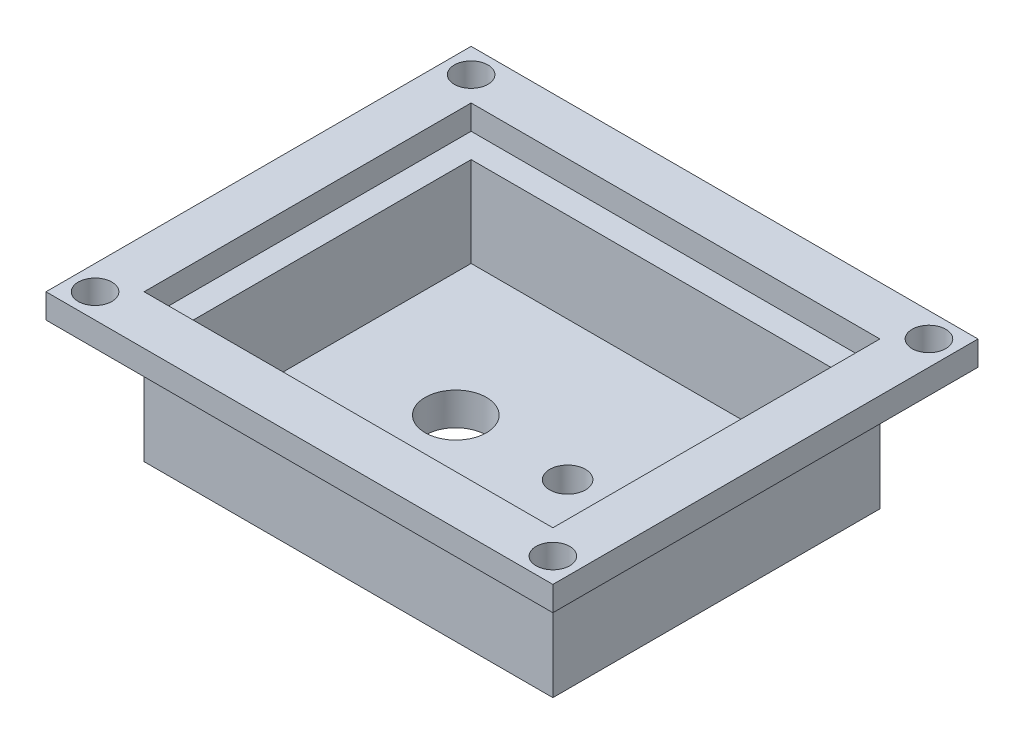
ISO-10303-21;
HEADER;
FILE_DESCRIPTION(('STEP AP214'),'2;1');
FILE_NAME('part.step','',(''),(''),'','','');
FILE_SCHEMA(('AUTOMOTIVE_DESIGN { 1 0 10303 214 1 1 1 1 }'));
ENDSEC;
DATA;
#1=APPLICATION_CONTEXT('core data for automotive mechanical design processes');
#2=APPLICATION_PROTOCOL_DEFINITION('international standard','automotive_design',2000,#1);
#3=PRODUCT_CONTEXT('',#1,'mechanical');
#4=PRODUCT('Part','Part','',(#3));
#5=PRODUCT_RELATED_PRODUCT_CATEGORY('part','',(#4));
#6=PRODUCT_DEFINITION_FORMATION('','',#4);
#7=PRODUCT_DEFINITION_CONTEXT('part definition',#1,'design');
#8=PRODUCT_DEFINITION('design','',#6,#7);
#9=PRODUCT_DEFINITION_SHAPE('','',#8);
#10=(LENGTH_UNIT() NAMED_UNIT(*) SI_UNIT(.MILLI.,.METRE.));
#11=(NAMED_UNIT(*) PLANE_ANGLE_UNIT() SI_UNIT($,.RADIAN.));
#12=(NAMED_UNIT(*) SI_UNIT($,.STERADIAN.) SOLID_ANGLE_UNIT());
#13=UNCERTAINTY_MEASURE_WITH_UNIT(LENGTH_MEASURE(1.E-05),#10,'distance_accuracy_value','');
#14=(GEOMETRIC_REPRESENTATION_CONTEXT(3) GLOBAL_UNCERTAINTY_ASSIGNED_CONTEXT((#13)) GLOBAL_UNIT_ASSIGNED_CONTEXT((#10,
#11,#12)) REPRESENTATION_CONTEXT('',''));
#15=CARTESIAN_POINT('',(0.,0.,0.));
#16=DIRECTION('',(0.,0.,1.));
#17=DIRECTION('',(1.,0.,0.));
#18=AXIS2_PLACEMENT_3D('',#15,#16,#17);
#19=CARTESIAN_POINT('',(-39.37,22.86,0.));
#20=DIRECTION('',(1.,0.,0.));
#21=DIRECTION('',(0.,0.,-1.));
#22=AXIS2_PLACEMENT_3D('',#19,#20,#21);
#23=PLANE('',#22);
#24=DIRECTION('',(0.,0.,1.));
#25=VECTOR('',#24,1.);
#26=CARTESIAN_POINT('',(-39.37,19.05,0.));
#27=LINE('',#26,#25);
#28=CARTESIAN_POINT('',(-39.37,19.05,-33.02));
#29=VERTEX_POINT('',#28);
#30=CARTESIAN_POINT('',(-39.37,19.05,33.02));
#31=VERTEX_POINT('',#30);
#32=EDGE_CURVE('E162',#29,#31,#27,.T.);
#33=ORIENTED_EDGE('',*,*,#32,.T.);
#34=DIRECTION('',(0.,-1.,0.));
#35=VECTOR('',#34,1.);
#36=CARTESIAN_POINT('',(-39.37,22.86,33.02));
#37=LINE('',#36,#35);
#38=CARTESIAN_POINT('',(-39.37,22.86,33.02));
#39=VERTEX_POINT('',#38);
#40=EDGE_CURVE('E12',#39,#31,#37,.T.);
#41=ORIENTED_EDGE('',*,*,#40,.F.);
#42=DIRECTION('',(0.,0.,1.));
#43=VECTOR('',#42,1.);
#44=CARTESIAN_POINT('',(-39.37,22.86,0.));
#45=LINE('',#44,#43);
#46=CARTESIAN_POINT('',(-39.37,22.86,-33.02));
#47=VERTEX_POINT('',#46);
#48=EDGE_CURVE('E134',#47,#39,#45,.T.);
#49=ORIENTED_EDGE('',*,*,#48,.F.);
#50=DIRECTION('',(0.,-1.,0.));
#51=VECTOR('',#50,1.);
#52=CARTESIAN_POINT('',(-39.37,22.86,-33.02));
#53=LINE('',#52,#51);
#54=EDGE_CURVE('E169',#47,#29,#53,.T.);
#55=ORIENTED_EDGE('',*,*,#54,.T.);
#56=EDGE_LOOP('',(#33,#41,#49,#55));
#57=FACE_BOUND('',#56,.T.);
#58=ADVANCED_FACE('F52',(#57),#23,.F.);
#59=CARTESIAN_POINT('',(0.,22.86,33.02));
#60=DIRECTION('',(0.,0.,-1.));
#61=DIRECTION('',(-1.,0.,0.));
#62=AXIS2_PLACEMENT_3D('',#59,#60,#61);
#63=PLANE('',#62);
#64=DIRECTION('',(1.,0.,0.));
#65=VECTOR('',#64,1.);
#66=CARTESIAN_POINT('',(0.,19.05,33.02));
#67=LINE('',#66,#65);
#68=CARTESIAN_POINT('',(39.37,19.05,33.02));
#69=VERTEX_POINT('',#68);
#70=EDGE_CURVE('E139',#31,#69,#67,.T.);
#71=ORIENTED_EDGE('',*,*,#70,.T.);
#72=DIRECTION('',(0.,-1.,0.));
#73=VECTOR('',#72,1.);
#74=CARTESIAN_POINT('',(39.37,22.86,33.02));
#75=LINE('',#74,#73);
#76=CARTESIAN_POINT('',(39.37,22.86,33.02));
#77=VERTEX_POINT('',#76);
#78=EDGE_CURVE('E64',#77,#69,#75,.T.);
#79=ORIENTED_EDGE('',*,*,#78,.F.);
#80=DIRECTION('',(1.,0.,0.));
#81=VECTOR('',#80,1.);
#82=CARTESIAN_POINT('',(0.,22.86,33.02));
#83=LINE('',#82,#81);
#84=EDGE_CURVE('E126',#39,#77,#83,.T.);
#85=ORIENTED_EDGE('',*,*,#84,.F.);
#86=ORIENTED_EDGE('',*,*,#40,.T.);
#87=EDGE_LOOP('',(#71,#79,#85,#86));
#88=FACE_BOUND('',#87,.T.);
#89=ADVANCED_FACE('F137',(#88),#63,.F.);
#90=CARTESIAN_POINT('',(39.37,22.86,0.));
#91=DIRECTION('',(-1.,0.,0.));
#92=DIRECTION('',(0.,0.,1.));
#93=AXIS2_PLACEMENT_3D('',#90,#91,#92);
#94=PLANE('',#93);
#95=DIRECTION('',(0.,0.,-1.));
#96=VECTOR('',#95,1.);
#97=CARTESIAN_POINT('',(39.37,19.05,0.));
#98=LINE('',#97,#96);
#99=CARTESIAN_POINT('',(39.37,19.05,-33.02));
#100=VERTEX_POINT('',#99);
#101=EDGE_CURVE('E103',#69,#100,#98,.T.);
#102=ORIENTED_EDGE('',*,*,#101,.T.);
#103=DIRECTION('',(0.,-1.,0.));
#104=VECTOR('',#103,1.);
#105=CARTESIAN_POINT('',(39.37,22.86,-33.02));
#106=LINE('',#105,#104);
#107=CARTESIAN_POINT('',(39.37,22.86,-33.02));
#108=VERTEX_POINT('',#107);
#109=EDGE_CURVE('E142',#108,#100,#106,.T.);
#110=ORIENTED_EDGE('',*,*,#109,.F.);
#111=DIRECTION('',(0.,0.,-1.));
#112=VECTOR('',#111,1.);
#113=CARTESIAN_POINT('',(39.37,22.86,0.));
#114=LINE('',#113,#112);
#115=EDGE_CURVE('E133',#77,#108,#114,.T.);
#116=ORIENTED_EDGE('',*,*,#115,.F.);
#117=ORIENTED_EDGE('',*,*,#78,.T.);
#118=EDGE_LOOP('',(#102,#110,#116,#117));
#119=FACE_BOUND('',#118,.T.);
#120=ADVANCED_FACE('F141',(#119),#94,.F.);
#121=CARTESIAN_POINT('',(31.75,22.86,0.));
#122=DIRECTION('',(-1.,0.,0.));
#123=DIRECTION('',(0.,0.,1.));
#124=AXIS2_PLACEMENT_3D('',#121,#122,#123);
#125=PLANE('',#124);
#126=DIRECTION('',(0.,0.,-1.));
#127=VECTOR('',#126,1.);
#128=CARTESIAN_POINT('',(31.75,19.05,0.));
#129=LINE('',#128,#127);
#130=CARTESIAN_POINT('',(31.75,19.05,25.4));
#131=VERTEX_POINT('',#130);
#132=CARTESIAN_POINT('',(31.75,19.05,-25.4));
#133=VERTEX_POINT('',#132);
#134=EDGE_CURVE('E146',#131,#133,#129,.T.);
#135=ORIENTED_EDGE('',*,*,#134,.F.);
#136=DIRECTION('',(0.,-1.,0.));
#137=VECTOR('',#136,1.);
#138=CARTESIAN_POINT('',(31.75,22.86,25.4));
#139=LINE('',#138,#137);
#140=CARTESIAN_POINT('',(31.75,22.86,25.4));
#141=VERTEX_POINT('',#140);
#142=EDGE_CURVE('E114',#141,#131,#139,.T.);
#143=ORIENTED_EDGE('',*,*,#142,.F.);
#144=DIRECTION('',(0.,0.,-1.));
#145=VECTOR('',#144,1.);
#146=CARTESIAN_POINT('',(31.75,22.86,0.));
#147=LINE('',#146,#145);
#148=CARTESIAN_POINT('',(31.75,22.86,-25.4));
#149=VERTEX_POINT('',#148);
#150=EDGE_CURVE('E166',#141,#149,#147,.T.);
#151=ORIENTED_EDGE('',*,*,#150,.T.);
#152=DIRECTION('',(0.,-1.,0.));
#153=VECTOR('',#152,1.);
#154=CARTESIAN_POINT('',(31.75,22.86,-25.4));
#155=LINE('',#154,#153);
#156=EDGE_CURVE('E143',#149,#133,#155,.T.);
#157=ORIENTED_EDGE('',*,*,#156,.T.);
#158=EDGE_LOOP('',(#135,#143,#151,#157));
#159=FACE_BOUND('',#158,.T.);
#160=ADVANCED_FACE('F54',(#159),#125,.T.);
#161=CARTESIAN_POINT('',(0.,22.86,25.4));
#162=DIRECTION('',(0.,0.,-1.));
#163=DIRECTION('',(-1.,0.,0.));
#164=AXIS2_PLACEMENT_3D('',#161,#162,#163);
#165=PLANE('',#164);
#166=DIRECTION('',(1.,0.,0.));
#167=VECTOR('',#166,1.);
#168=CARTESIAN_POINT('',(0.,19.05,25.4));
#169=LINE('',#168,#167);
#170=CARTESIAN_POINT('',(-31.75,19.05,25.4));
#171=VERTEX_POINT('',#170);
#172=EDGE_CURVE('E155',#171,#131,#169,.T.);
#173=ORIENTED_EDGE('',*,*,#172,.F.);
#174=DIRECTION('',(0.,-1.,0.));
#175=VECTOR('',#174,1.);
#176=CARTESIAN_POINT('',(-31.75,22.86,25.4));
#177=LINE('',#176,#175);
#178=CARTESIAN_POINT('',(-31.75,22.86,25.4));
#179=VERTEX_POINT('',#178);
#180=EDGE_CURVE('E174',#179,#171,#177,.T.);
#181=ORIENTED_EDGE('',*,*,#180,.F.);
#182=DIRECTION('',(1.,0.,0.));
#183=VECTOR('',#182,1.);
#184=CARTESIAN_POINT('',(0.,22.86,25.4));
#185=LINE('',#184,#183);
#186=EDGE_CURVE('E205',#179,#141,#185,.T.);
#187=ORIENTED_EDGE('',*,*,#186,.T.);
#188=ORIENTED_EDGE('',*,*,#142,.T.);
#189=EDGE_LOOP('',(#173,#181,#187,#188));
#190=FACE_BOUND('',#189,.T.);
#191=ADVANCED_FACE('F224',(#190),#165,.T.);
#192=CARTESIAN_POINT('',(-31.75,22.86,0.));
#193=DIRECTION('',(1.,0.,0.));
#194=DIRECTION('',(0.,0.,-1.));
#195=AXIS2_PLACEMENT_3D('',#192,#193,#194);
#196=PLANE('',#195);
#197=DIRECTION('',(0.,0.,1.));
#198=VECTOR('',#197,1.);
#199=CARTESIAN_POINT('',(-31.75,19.05,0.));
#200=LINE('',#199,#198);
#201=CARTESIAN_POINT('',(-31.75,19.05,-25.4));
#202=VERTEX_POINT('',#201);
#203=EDGE_CURVE('E156',#202,#171,#200,.T.);
#204=ORIENTED_EDGE('',*,*,#203,.F.);
#205=DIRECTION('',(0.,-1.,0.));
#206=VECTOR('',#205,1.);
#207=CARTESIAN_POINT('',(-31.75,22.86,-25.4));
#208=LINE('',#207,#206);
#209=CARTESIAN_POINT('',(-31.75,22.86,-25.4));
#210=VERTEX_POINT('',#209);
#211=EDGE_CURVE('E173',#210,#202,#208,.T.);
#212=ORIENTED_EDGE('',*,*,#211,.F.);
#213=DIRECTION('',(0.,0.,1.));
#214=VECTOR('',#213,1.);
#215=CARTESIAN_POINT('',(-31.75,22.86,0.));
#216=LINE('',#215,#214);
#217=EDGE_CURVE('E204',#210,#179,#216,.T.);
#218=ORIENTED_EDGE('',*,*,#217,.T.);
#219=ORIENTED_EDGE('',*,*,#180,.T.);
#220=EDGE_LOOP('',(#204,#212,#218,#219));
#221=FACE_BOUND('',#220,.T.);
#222=ADVANCED_FACE('F217',(#221),#196,.T.);
#223=CARTESIAN_POINT('',(0.,22.86,-25.4));
#224=DIRECTION('',(0.,0.,1.));
#225=DIRECTION('',(1.,0.,0.));
#226=AXIS2_PLACEMENT_3D('',#223,#224,#225);
#227=PLANE('',#226);
#228=DIRECTION('',(-1.,0.,0.));
#229=VECTOR('',#228,1.);
#230=CARTESIAN_POINT('',(0.,19.05,-25.4));
#231=LINE('',#230,#229);
#232=EDGE_CURVE('E157',#133,#202,#231,.T.);
#233=ORIENTED_EDGE('',*,*,#232,.F.);
#234=ORIENTED_EDGE('',*,*,#156,.F.);
#235=DIRECTION('',(-1.,0.,0.));
#236=VECTOR('',#235,1.);
#237=CARTESIAN_POINT('',(0.,22.86,-25.4));
#238=LINE('',#237,#236);
#239=EDGE_CURVE('E206',#149,#210,#238,.T.);
#240=ORIENTED_EDGE('',*,*,#239,.T.);
#241=ORIENTED_EDGE('',*,*,#211,.T.);
#242=EDGE_LOOP('',(#233,#234,#240,#241));
#243=FACE_BOUND('',#242,.T.);
#244=ADVANCED_FACE('F214',(#243),#227,.T.);
#245=CARTESIAN_POINT('',(0.,22.86,-33.02));
#246=DIRECTION('',(0.,0.,1.));
#247=DIRECTION('',(1.,0.,0.));
#248=AXIS2_PLACEMENT_3D('',#245,#246,#247);
#249=PLANE('',#248);
#250=DIRECTION('',(-1.,0.,0.));
#251=VECTOR('',#250,1.);
#252=CARTESIAN_POINT('',(0.,19.05,-33.02));
#253=LINE('',#252,#251);
#254=EDGE_CURVE('E110',#100,#29,#253,.T.);
#255=ORIENTED_EDGE('',*,*,#254,.T.);
#256=ORIENTED_EDGE('',*,*,#54,.F.);
#257=DIRECTION('',(-1.,0.,0.));
#258=VECTOR('',#257,1.);
#259=CARTESIAN_POINT('',(0.,22.86,-33.02));
#260=LINE('',#259,#258);
#261=EDGE_CURVE('E75',#108,#47,#260,.T.);
#262=ORIENTED_EDGE('',*,*,#261,.F.);
#263=ORIENTED_EDGE('',*,*,#109,.T.);
#264=EDGE_LOOP('',(#255,#256,#262,#263));
#265=FACE_BOUND('',#264,.T.);
#266=ADVANCED_FACE('F245',(#265),#249,.F.);
#267=CARTESIAN_POINT('',(0.,22.86,0.));
#268=DIRECTION('',(0.,1.,0.));
#269=DIRECTION('',(0.,0.,1.));
#270=AXIS2_PLACEMENT_3D('',#267,#268,#269);
#271=PLANE('',#270);
#272=CARTESIAN_POINT('',(-35.56,22.86,-29.21));
#273=DIRECTION('',(0.,1.,0.));
#274=DIRECTION('',(0.,0.,1.));
#275=AXIS2_PLACEMENT_3D('',#272,#273,#274);
#276=CIRCLE('',#275,2.6162);
#277=CARTESIAN_POINT('',(-35.56,22.86,-26.5938));
#278=VERTEX_POINT('',#277);
#279=EDGE_CURVE('E191',#278,#278,#276,.T.);
#280=ORIENTED_EDGE('',*,*,#279,.F.);
#281=EDGE_LOOP('',(#280));
#282=FACE_BOUND('',#281,.T.);
#283=CARTESIAN_POINT('',(35.56,22.86,-29.21));
#284=DIRECTION('',(0.,1.,0.));
#285=DIRECTION('',(0.,0.,1.));
#286=AXIS2_PLACEMENT_3D('',#283,#284,#285);
#287=CIRCLE('',#286,2.6162);
#288=CARTESIAN_POINT('',(35.56,22.86,-26.5938));
#289=VERTEX_POINT('',#288);
#290=EDGE_CURVE('E182',#289,#289,#287,.T.);
#291=ORIENTED_EDGE('',*,*,#290,.F.);
#292=EDGE_LOOP('',(#291));
#293=FACE_BOUND('',#292,.T.);
#294=CARTESIAN_POINT('',(35.56,22.86,29.21));
#295=DIRECTION('',(0.,1.,0.));
#296=DIRECTION('',(0.,0.,1.));
#297=AXIS2_PLACEMENT_3D('',#294,#295,#296);
#298=CIRCLE('',#297,2.6162);
#299=CARTESIAN_POINT('',(35.56,22.86,31.8262));
#300=VERTEX_POINT('',#299);
#301=EDGE_CURVE('E185',#300,#300,#298,.T.);
#302=ORIENTED_EDGE('',*,*,#301,.F.);
#303=EDGE_LOOP('',(#302));
#304=FACE_BOUND('',#303,.T.);
#305=CARTESIAN_POINT('',(-35.56,22.86,29.21));
#306=DIRECTION('',(0.,1.,0.));
#307=DIRECTION('',(0.,0.,1.));
#308=AXIS2_PLACEMENT_3D('',#305,#306,#307);
#309=CIRCLE('',#308,2.6162);
#310=CARTESIAN_POINT('',(-35.56,22.86,31.8262));
#311=VERTEX_POINT('',#310);
#312=EDGE_CURVE('E177',#311,#311,#309,.T.);
#313=ORIENTED_EDGE('',*,*,#312,.F.);
#314=EDGE_LOOP('',(#313));
#315=FACE_BOUND('',#314,.T.);
#316=ORIENTED_EDGE('',*,*,#150,.F.);
#317=ORIENTED_EDGE('',*,*,#186,.F.);
#318=ORIENTED_EDGE('',*,*,#217,.F.);
#319=ORIENTED_EDGE('',*,*,#239,.F.);
#320=EDGE_LOOP('',(#316,#317,#318,#319));
#321=FACE_BOUND('',#320,.T.);
#322=ORIENTED_EDGE('',*,*,#48,.T.);
#323=ORIENTED_EDGE('',*,*,#84,.T.);
#324=ORIENTED_EDGE('',*,*,#115,.T.);
#325=ORIENTED_EDGE('',*,*,#261,.T.);
#326=EDGE_LOOP('',(#322,#323,#324,#325));
#327=FACE_BOUND('',#326,.T.);
#328=ADVANCED_FACE('F131',(#282,#293,#304,#315,#321,#327),#271,.T.);
#329=CARTESIAN_POINT('',(0.,19.05,0.));
#330=DIRECTION('',(0.,1.,0.));
#331=DIRECTION('',(0.,0.,1.));
#332=AXIS2_PLACEMENT_3D('',#329,#330,#331);
#333=PLANE('',#332);
#334=CARTESIAN_POINT('',(-35.56,19.05,-29.21));
#335=DIRECTION('',(0.,1.,0.));
#336=DIRECTION('',(0.,0.,1.));
#337=AXIS2_PLACEMENT_3D('',#334,#335,#336);
#338=CIRCLE('',#337,2.6162);
#339=CARTESIAN_POINT('',(-35.56,19.05,-26.5938));
#340=VERTEX_POINT('',#339);
#341=EDGE_CURVE('E60',#340,#340,#338,.T.);
#342=ORIENTED_EDGE('',*,*,#341,.T.);
#343=EDGE_LOOP('',(#342));
#344=FACE_BOUND('',#343,.T.);
#345=CARTESIAN_POINT('',(35.56,19.05,-29.21));
#346=DIRECTION('',(0.,1.,0.));
#347=DIRECTION('',(0.,0.,1.));
#348=AXIS2_PLACEMENT_3D('',#345,#346,#347);
#349=CIRCLE('',#348,2.6162);
#350=CARTESIAN_POINT('',(35.56,19.05,-26.5938));
#351=VERTEX_POINT('',#350);
#352=EDGE_CURVE('E179',#351,#351,#349,.T.);
#353=ORIENTED_EDGE('',*,*,#352,.T.);
#354=EDGE_LOOP('',(#353));
#355=FACE_BOUND('',#354,.T.);
#356=CARTESIAN_POINT('',(35.56,19.05,29.21));
#357=DIRECTION('',(0.,1.,0.));
#358=DIRECTION('',(0.,0.,1.));
#359=AXIS2_PLACEMENT_3D('',#356,#357,#358);
#360=CIRCLE('',#359,2.6162);
#361=CARTESIAN_POINT('',(35.56,19.05,31.8262));
#362=VERTEX_POINT('',#361);
#363=EDGE_CURVE('E190',#362,#362,#360,.T.);
#364=ORIENTED_EDGE('',*,*,#363,.T.);
#365=EDGE_LOOP('',(#364));
#366=FACE_BOUND('',#365,.T.);
#367=CARTESIAN_POINT('',(-35.56,19.05,29.21));
#368=DIRECTION('',(0.,1.,0.));
#369=DIRECTION('',(0.,0.,1.));
#370=AXIS2_PLACEMENT_3D('',#367,#368,#369);
#371=CIRCLE('',#370,2.6162);
#372=CARTESIAN_POINT('',(-35.56,19.05,31.8262));
#373=VERTEX_POINT('',#372);
#374=EDGE_CURVE('E153',#373,#373,#371,.T.);
#375=ORIENTED_EDGE('',*,*,#374,.T.);
#376=EDGE_LOOP('',(#375));
#377=FACE_BOUND('',#376,.T.);
#378=ORIENTED_EDGE('',*,*,#134,.T.);
#379=ORIENTED_EDGE('',*,*,#232,.T.);
#380=ORIENTED_EDGE('',*,*,#203,.T.);
#381=ORIENTED_EDGE('',*,*,#172,.T.);
#382=EDGE_LOOP('',(#378,#379,#380,#381));
#383=FACE_BOUND('',#382,.T.);
#384=ORIENTED_EDGE('',*,*,#32,.F.);
#385=ORIENTED_EDGE('',*,*,#254,.F.);
#386=ORIENTED_EDGE('',*,*,#101,.F.);
#387=ORIENTED_EDGE('',*,*,#70,.F.);
#388=EDGE_LOOP('',(#384,#385,#386,#387));
#389=FACE_BOUND('',#388,.T.);
#390=ADVANCED_FACE('F225',(#344,#355,#366,#377,#383,#389),#333,.F.);
#391=CARTESIAN_POINT('',(-35.56,22.86,29.21));
#392=DIRECTION('',(0.,1.,0.));
#393=DIRECTION('',(0.,0.,1.));
#394=AXIS2_PLACEMENT_3D('',#391,#392,#393);
#395=CYLINDRICAL_SURFACE('',#394,2.6162);
#396=ORIENTED_EDGE('',*,*,#312,.T.);
#397=EDGE_LOOP('',(#396));
#398=FACE_BOUND('',#397,.T.);
#399=ORIENTED_EDGE('',*,*,#374,.F.);
#400=EDGE_LOOP('',(#399));
#401=FACE_BOUND('',#400,.T.);
#402=ADVANCED_FACE('F273',(#398,#401),#395,.F.);
#403=CARTESIAN_POINT('',(35.56,22.86,29.21));
#404=DIRECTION('',(0.,1.,0.));
#405=DIRECTION('',(0.,0.,1.));
#406=AXIS2_PLACEMENT_3D('',#403,#404,#405);
#407=CYLINDRICAL_SURFACE('',#406,2.6162);
#408=ORIENTED_EDGE('',*,*,#301,.T.);
#409=EDGE_LOOP('',(#408));
#410=FACE_BOUND('',#409,.T.);
#411=ORIENTED_EDGE('',*,*,#363,.F.);
#412=EDGE_LOOP('',(#411));
#413=FACE_BOUND('',#412,.T.);
#414=ADVANCED_FACE('F282',(#410,#413),#407,.F.);
#415=CARTESIAN_POINT('',(35.56,22.86,-29.21));
#416=DIRECTION('',(0.,1.,0.));
#417=DIRECTION('',(0.,0.,1.));
#418=AXIS2_PLACEMENT_3D('',#415,#416,#417);
#419=CYLINDRICAL_SURFACE('',#418,2.6162);
#420=ORIENTED_EDGE('',*,*,#290,.T.);
#421=EDGE_LOOP('',(#420));
#422=FACE_BOUND('',#421,.T.);
#423=ORIENTED_EDGE('',*,*,#352,.F.);
#424=EDGE_LOOP('',(#423));
#425=FACE_BOUND('',#424,.T.);
#426=ADVANCED_FACE('F291',(#422,#425),#419,.F.);
#427=CARTESIAN_POINT('',(-35.56,22.86,-29.21));
#428=DIRECTION('',(0.,1.,0.));
#429=DIRECTION('',(0.,0.,1.));
#430=AXIS2_PLACEMENT_3D('',#427,#428,#429);
#431=CYLINDRICAL_SURFACE('',#430,2.6162);
#432=ORIENTED_EDGE('',*,*,#279,.T.);
#433=EDGE_LOOP('',(#432));
#434=FACE_BOUND('',#433,.T.);
#435=ORIENTED_EDGE('',*,*,#341,.F.);
#436=EDGE_LOOP('',(#435));
#437=FACE_BOUND('',#436,.T.);
#438=ADVANCED_FACE('F305',(#434,#437),#431,.F.);
#439=CLOSED_SHELL('',(#58,#89,#120,#160,#191,#222,#244,#266,#328,#390,#402,#414,#426,#438));
#440=MANIFOLD_SOLID_BREP('B2',#439);
#441=CARTESIAN_POINT('',(31.75,19.05,25.4));
#442=DIRECTION('',(-1.,0.,0.));
#443=DIRECTION('',(0.,0.,1.));
#444=AXIS2_PLACEMENT_3D('',#441,#442,#443);
#445=PLANE('',#444);
#446=DIRECTION('',(0.,0.,-1.));
#447=VECTOR('',#446,1.);
#448=CARTESIAN_POINT('',(31.75,0.,25.4));
#449=LINE('',#448,#447);
#450=CARTESIAN_POINT('',(31.75,0.,25.4));
#451=VERTEX_POINT('',#450);
#452=CARTESIAN_POINT('',(31.75,0.,-25.4));
#453=VERTEX_POINT('',#452);
#454=EDGE_CURVE('E495',#451,#453,#449,.T.);
#455=ORIENTED_EDGE('',*,*,#454,.T.);
#456=DIRECTION('',(0.,-1.,0.));
#457=VECTOR('',#456,1.);
#458=CARTESIAN_POINT('',(31.75,19.05,-25.4));
#459=LINE('',#458,#457);
#460=CARTESIAN_POINT('',(31.75,19.05,-25.4));
#461=VERTEX_POINT('',#460);
#462=EDGE_CURVE('E51',#461,#453,#459,.T.);
#463=ORIENTED_EDGE('',*,*,#462,.F.);
#464=DIRECTION('',(0.,0.,-1.));
#465=VECTOR('',#464,1.);
#466=CARTESIAN_POINT('',(31.75,19.05,25.4));
#467=LINE('',#466,#465);
#468=CARTESIAN_POINT('',(31.75,19.05,25.4));
#469=VERTEX_POINT('',#468);
#470=EDGE_CURVE('E496',#469,#461,#467,.T.);
#471=ORIENTED_EDGE('',*,*,#470,.F.);
#472=DIRECTION('',(0.,-1.,0.));
#473=VECTOR('',#472,1.);
#474=CARTESIAN_POINT('',(31.75,19.05,25.4));
#475=LINE('',#474,#473);
#476=EDGE_CURVE('E505',#469,#451,#475,.T.);
#477=ORIENTED_EDGE('',*,*,#476,.T.);
#478=EDGE_LOOP('',(#455,#463,#471,#477));
#479=FACE_BOUND('',#478,.T.);
#480=ADVANCED_FACE('F378',(#479),#445,.F.);
#481=CARTESIAN_POINT('',(-31.75,19.05,-25.4));
#482=DIRECTION('',(0.,0.,1.));
#483=DIRECTION('',(1.,0.,0.));
#484=AXIS2_PLACEMENT_3D('',#481,#482,#483);
#485=PLANE('',#484);
#486=DIRECTION('',(-1.,0.,0.));
#487=VECTOR('',#486,1.);
#488=CARTESIAN_POINT('',(-31.75,0.,-25.4));
#489=LINE('',#488,#487);
#490=CARTESIAN_POINT('',(-31.75,0.,-25.4));
#491=VERTEX_POINT('',#490);
#492=EDGE_CURVE('E504',#453,#491,#489,.T.);
#493=ORIENTED_EDGE('',*,*,#492,.T.);
#494=DIRECTION('',(0.,-1.,0.));
#495=VECTOR('',#494,1.);
#496=CARTESIAN_POINT('',(-31.75,19.05,-25.4));
#497=LINE('',#496,#495);
#498=CARTESIAN_POINT('',(-31.75,19.05,-25.4));
#499=VERTEX_POINT('',#498);
#500=EDGE_CURVE('E390',#499,#491,#497,.T.);
#501=ORIENTED_EDGE('',*,*,#500,.F.);
#502=DIRECTION('',(-1.,0.,0.));
#503=VECTOR('',#502,1.);
#504=CARTESIAN_POINT('',(-31.75,19.05,-25.4));
#505=LINE('',#504,#503);
#506=EDGE_CURVE('E435',#461,#499,#505,.T.);
#507=ORIENTED_EDGE('',*,*,#506,.F.);
#508=ORIENTED_EDGE('',*,*,#462,.T.);
#509=EDGE_LOOP('',(#493,#501,#507,#508));
#510=FACE_BOUND('',#509,.T.);
#511=ADVANCED_FACE('F545',(#510),#485,.F.);
#512=CARTESIAN_POINT('',(-31.75,19.05,25.4));
#513=DIRECTION('',(1.,0.,0.));
#514=DIRECTION('',(0.,0.,-1.));
#515=AXIS2_PLACEMENT_3D('',#512,#513,#514);
#516=PLANE('',#515);
#517=DIRECTION('',(0.,0.,1.));
#518=VECTOR('',#517,1.);
#519=CARTESIAN_POINT('',(-31.75,0.,25.4));
#520=LINE('',#519,#518);
#521=CARTESIAN_POINT('',(-31.75,0.,25.4));
#522=VERTEX_POINT('',#521);
#523=EDGE_CURVE('E510',#491,#522,#520,.T.);
#524=ORIENTED_EDGE('',*,*,#523,.T.);
#525=DIRECTION('',(0.,-1.,0.));
#526=VECTOR('',#525,1.);
#527=CARTESIAN_POINT('',(-31.75,19.05,25.4));
#528=LINE('',#527,#526);
#529=CARTESIAN_POINT('',(-31.75,19.05,25.4));
#530=VERTEX_POINT('',#529);
#531=EDGE_CURVE('E512',#530,#522,#528,.T.);
#532=ORIENTED_EDGE('',*,*,#531,.F.);
#533=DIRECTION('',(0.,0.,1.));
#534=VECTOR('',#533,1.);
#535=CARTESIAN_POINT('',(-31.75,19.05,25.4));
#536=LINE('',#535,#534);
#537=EDGE_CURVE('E497',#499,#530,#536,.T.);
#538=ORIENTED_EDGE('',*,*,#537,.F.);
#539=ORIENTED_EDGE('',*,*,#500,.T.);
#540=EDGE_LOOP('',(#524,#532,#538,#539));
#541=FACE_BOUND('',#540,.T.);
#542=ADVANCED_FACE('F550',(#541),#516,.F.);
#543=CARTESIAN_POINT('',(-31.75,19.05,25.4));
#544=DIRECTION('',(0.,0.,-1.));
#545=DIRECTION('',(-1.,0.,0.));
#546=AXIS2_PLACEMENT_3D('',#543,#544,#545);
#547=PLANE('',#546);
#548=DIRECTION('',(1.,0.,0.));
#549=VECTOR('',#548,1.);
#550=CARTESIAN_POINT('',(-31.75,0.,25.4));
#551=LINE('',#550,#549);
#552=EDGE_CURVE('E424',#522,#451,#551,.T.);
#553=ORIENTED_EDGE('',*,*,#552,.T.);
#554=ORIENTED_EDGE('',*,*,#476,.F.);
#555=DIRECTION('',(1.,0.,0.));
#556=VECTOR('',#555,1.);
#557=CARTESIAN_POINT('',(-31.75,19.05,25.4));
#558=LINE('',#557,#556);
#559=EDGE_CURVE('E404',#530,#469,#558,.T.);
#560=ORIENTED_EDGE('',*,*,#559,.F.);
#561=ORIENTED_EDGE('',*,*,#531,.T.);
#562=EDGE_LOOP('',(#553,#554,#560,#561));
#563=FACE_BOUND('',#562,.T.);
#564=ADVANCED_FACE('F559',(#563),#547,.F.);
#565=CARTESIAN_POINT('',(0.,19.05,0.));
#566=DIRECTION('',(0.,-1.,0.));
#567=DIRECTION('',(0.,0.,-1.));
#568=AXIS2_PLACEMENT_3D('',#565,#566,#567);
#569=PLANE('',#568);
#570=DIRECTION('',(-1.,0.,0.));
#571=VECTOR('',#570,1.);
#572=CARTESIAN_POINT('',(-27.94,19.05,-21.59));
#573=LINE('',#572,#571);
#574=CARTESIAN_POINT('',(27.94,19.05,-21.59));
#575=VERTEX_POINT('',#574);
#576=CARTESIAN_POINT('',(-27.94,19.05,-21.59));
#577=VERTEX_POINT('',#576);
#578=EDGE_CURVE('E488',#575,#577,#573,.T.);
#579=ORIENTED_EDGE('',*,*,#578,.F.);
#580=DIRECTION('',(0.,0.,-1.));
#581=VECTOR('',#580,1.);
#582=CARTESIAN_POINT('',(27.94,19.05,21.59));
#583=LINE('',#582,#581);
#584=CARTESIAN_POINT('',(27.94,19.05,21.59));
#585=VERTEX_POINT('',#584);
#586=EDGE_CURVE('E394',#585,#575,#583,.T.);
#587=ORIENTED_EDGE('',*,*,#586,.F.);
#588=DIRECTION('',(1.,0.,0.));
#589=VECTOR('',#588,1.);
#590=CARTESIAN_POINT('',(-27.94,19.05,21.59));
#591=LINE('',#590,#589);
#592=CARTESIAN_POINT('',(-27.94,19.05,21.59));
#593=VERTEX_POINT('',#592);
#594=EDGE_CURVE('E471',#593,#585,#591,.T.);
#595=ORIENTED_EDGE('',*,*,#594,.F.);
#596=DIRECTION('',(0.,0.,1.));
#597=VECTOR('',#596,1.);
#598=CARTESIAN_POINT('',(-27.94,19.05,21.59));
#599=LINE('',#598,#597);
#600=EDGE_CURVE('E480',#577,#593,#599,.T.);
#601=ORIENTED_EDGE('',*,*,#600,.F.);
#602=EDGE_LOOP('',(#579,#587,#595,#601));
#603=FACE_BOUND('',#602,.T.);
#604=ORIENTED_EDGE('',*,*,#470,.T.);
#605=ORIENTED_EDGE('',*,*,#506,.T.);
#606=ORIENTED_EDGE('',*,*,#537,.T.);
#607=ORIENTED_EDGE('',*,*,#559,.T.);
#608=EDGE_LOOP('',(#604,#605,#606,#607));
#609=FACE_BOUND('',#608,.T.);
#610=ADVANCED_FACE('F560',(#603,#609),#569,.F.);
#611=CARTESIAN_POINT('',(0.,0.,0.));
#612=DIRECTION('',(0.,-1.,0.));
#613=DIRECTION('',(0.,0.,-1.));
#614=AXIS2_PLACEMENT_3D('',#611,#612,#613);
#615=PLANE('',#614);
#616=CARTESIAN_POINT('',(-8.73125,0.,0.));
#617=DIRECTION('',(0.,-1.,0.));
#618=DIRECTION('',(0.,0.,-1.));
#619=AXIS2_PLACEMENT_3D('',#616,#617,#618);
#620=CIRCLE('',#619,4.7625);
#621=CARTESIAN_POINT('',(-8.73125,0.,-4.7625));
#622=VERTEX_POINT('',#621);
#623=EDGE_CURVE('E385',#622,#622,#620,.T.);
#624=ORIENTED_EDGE('',*,*,#623,.F.);
#625=EDGE_LOOP('',(#624));
#626=FACE_BOUND('',#625,.T.);
#627=CARTESIAN_POINT('',(8.636,0.,0.));
#628=DIRECTION('',(0.,-1.,0.));
#629=DIRECTION('',(0.,0.,-1.));
#630=AXIS2_PLACEMENT_3D('',#627,#628,#629);
#631=CIRCLE('',#630,2.778125);
#632=CARTESIAN_POINT('',(8.636,0.,-2.778125));
#633=VERTEX_POINT('',#632);
#634=EDGE_CURVE('E511',#633,#633,#631,.T.);
#635=ORIENTED_EDGE('',*,*,#634,.F.);
#636=EDGE_LOOP('',(#635));
#637=FACE_BOUND('',#636,.T.);
#638=ORIENTED_EDGE('',*,*,#454,.F.);
#639=ORIENTED_EDGE('',*,*,#552,.F.);
#640=ORIENTED_EDGE('',*,*,#523,.F.);
#641=ORIENTED_EDGE('',*,*,#492,.F.);
#642=EDGE_LOOP('',(#638,#639,#640,#641));
#643=FACE_BOUND('',#642,.T.);
#644=ADVANCED_FACE('F552',(#626,#637,#643),#615,.T.);
#645=CARTESIAN_POINT('',(27.94,5.08,21.59));
#646=DIRECTION('',(1.,0.,0.));
#647=DIRECTION('',(0.,0.,-1.));
#648=AXIS2_PLACEMENT_3D('',#645,#646,#647);
#649=PLANE('',#648);
#650=ORIENTED_EDGE('',*,*,#586,.T.);
#651=DIRECTION('',(0.,1.,0.));
#652=VECTOR('',#651,1.);
#653=CARTESIAN_POINT('',(27.94,5.08,-21.59));
#654=LINE('',#653,#652);
#655=CARTESIAN_POINT('',(27.94,5.08,-21.59));
#656=VERTEX_POINT('',#655);
#657=EDGE_CURVE('E455',#656,#575,#654,.T.);
#658=ORIENTED_EDGE('',*,*,#657,.F.);
#659=DIRECTION('',(0.,0.,-1.));
#660=VECTOR('',#659,1.);
#661=CARTESIAN_POINT('',(27.94,5.08,21.59));
#662=LINE('',#661,#660);
#663=CARTESIAN_POINT('',(27.94,5.08,21.59));
#664=VERTEX_POINT('',#663);
#665=EDGE_CURVE('E456',#664,#656,#662,.T.);
#666=ORIENTED_EDGE('',*,*,#665,.F.);
#667=DIRECTION('',(0.,1.,0.));
#668=VECTOR('',#667,1.);
#669=CARTESIAN_POINT('',(27.94,5.08,21.59));
#670=LINE('',#669,#668);
#671=EDGE_CURVE('E489',#664,#585,#670,.T.);
#672=ORIENTED_EDGE('',*,*,#671,.T.);
#673=EDGE_LOOP('',(#650,#658,#666,#672));
#674=FACE_BOUND('',#673,.T.);
#675=ADVANCED_FACE('F451',(#674),#649,.F.);
#676=CARTESIAN_POINT('',(-27.94,5.08,21.59));
#677=DIRECTION('',(0.,0.,1.));
#678=DIRECTION('',(1.,0.,0.));
#679=AXIS2_PLACEMENT_3D('',#676,#677,#678);
#680=PLANE('',#679);
#681=ORIENTED_EDGE('',*,*,#594,.T.);
#682=ORIENTED_EDGE('',*,*,#671,.F.);
#683=DIRECTION('',(1.,0.,0.));
#684=VECTOR('',#683,1.);
#685=CARTESIAN_POINT('',(-27.94,5.08,21.59));
#686=LINE('',#685,#684);
#687=CARTESIAN_POINT('',(-27.94,5.08,21.59));
#688=VERTEX_POINT('',#687);
#689=EDGE_CURVE('E465',#688,#664,#686,.T.);
#690=ORIENTED_EDGE('',*,*,#689,.F.);
#691=DIRECTION('',(0.,1.,0.));
#692=VECTOR('',#691,1.);
#693=CARTESIAN_POINT('',(-27.94,5.08,21.59));
#694=LINE('',#693,#692);
#695=EDGE_CURVE('E491',#688,#593,#694,.T.);
#696=ORIENTED_EDGE('',*,*,#695,.T.);
#697=EDGE_LOOP('',(#681,#682,#690,#696));
#698=FACE_BOUND('',#697,.T.);
#699=ADVANCED_FACE('F598',(#698),#680,.F.);
#700=CARTESIAN_POINT('',(-27.94,5.08,21.59));
#701=DIRECTION('',(-1.,0.,0.));
#702=DIRECTION('',(0.,0.,1.));
#703=AXIS2_PLACEMENT_3D('',#700,#701,#702);
#704=PLANE('',#703);
#705=ORIENTED_EDGE('',*,*,#600,.T.);
#706=ORIENTED_EDGE('',*,*,#695,.F.);
#707=DIRECTION('',(0.,0.,1.));
#708=VECTOR('',#707,1.);
#709=CARTESIAN_POINT('',(-27.94,5.08,21.59));
#710=LINE('',#709,#708);
#711=CARTESIAN_POINT('',(-27.94,5.08,-21.59));
#712=VERTEX_POINT('',#711);
#713=EDGE_CURVE('E468',#712,#688,#710,.T.);
#714=ORIENTED_EDGE('',*,*,#713,.F.);
#715=DIRECTION('',(0.,1.,0.));
#716=VECTOR('',#715,1.);
#717=CARTESIAN_POINT('',(-27.94,5.08,-21.59));
#718=LINE('',#717,#716);
#719=EDGE_CURVE('E461',#712,#577,#718,.T.);
#720=ORIENTED_EDGE('',*,*,#719,.T.);
#721=EDGE_LOOP('',(#705,#706,#714,#720));
#722=FACE_BOUND('',#721,.T.);
#723=ADVANCED_FACE('F539',(#722),#704,.F.);
#724=CARTESIAN_POINT('',(-27.94,5.08,-21.59));
#725=DIRECTION('',(0.,0.,-1.));
#726=DIRECTION('',(-1.,0.,0.));
#727=AXIS2_PLACEMENT_3D('',#724,#725,#726);
#728=PLANE('',#727);
#729=ORIENTED_EDGE('',*,*,#578,.T.);
#730=ORIENTED_EDGE('',*,*,#719,.F.);
#731=DIRECTION('',(-1.,0.,0.));
#732=VECTOR('',#731,1.);
#733=CARTESIAN_POINT('',(-27.94,5.08,-21.59));
#734=LINE('',#733,#732);
#735=EDGE_CURVE('E464',#656,#712,#734,.T.);
#736=ORIENTED_EDGE('',*,*,#735,.F.);
#737=ORIENTED_EDGE('',*,*,#657,.T.);
#738=EDGE_LOOP('',(#729,#730,#736,#737));
#739=FACE_BOUND('',#738,.T.);
#740=ADVANCED_FACE('F467',(#739),#728,.F.);
#741=CARTESIAN_POINT('',(0.,5.08,0.));
#742=DIRECTION('',(0.,-1.,0.));
#743=DIRECTION('',(0.,0.,-1.));
#744=AXIS2_PLACEMENT_3D('',#741,#742,#743);
#745=PLANE('',#744);
#746=CARTESIAN_POINT('',(-8.73125,5.08,0.));
#747=DIRECTION('',(0.,1.,0.));
#748=DIRECTION('',(0.,0.,1.));
#749=AXIS2_PLACEMENT_3D('',#746,#747,#748);
#750=CIRCLE('',#749,4.7625);
#751=CARTESIAN_POINT('',(-8.73125,5.08,4.7625));
#752=VERTEX_POINT('',#751);
#753=EDGE_CURVE('E517',#752,#752,#750,.T.);
#754=ORIENTED_EDGE('',*,*,#753,.F.);
#755=EDGE_LOOP('',(#754));
#756=FACE_BOUND('',#755,.T.);
#757=CARTESIAN_POINT('',(8.636,5.08,0.));
#758=DIRECTION('',(0.,1.,0.));
#759=DIRECTION('',(0.,0.,1.));
#760=AXIS2_PLACEMENT_3D('',#757,#758,#759);
#761=CIRCLE('',#760,2.778125);
#762=CARTESIAN_POINT('',(8.636,5.08,2.778125));
#763=VERTEX_POINT('',#762);
#764=EDGE_CURVE('E479',#763,#763,#761,.T.);
#765=ORIENTED_EDGE('',*,*,#764,.F.);
#766=EDGE_LOOP('',(#765));
#767=FACE_BOUND('',#766,.T.);
#768=ORIENTED_EDGE('',*,*,#665,.T.);
#769=ORIENTED_EDGE('',*,*,#735,.T.);
#770=ORIENTED_EDGE('',*,*,#713,.T.);
#771=ORIENTED_EDGE('',*,*,#689,.T.);
#772=EDGE_LOOP('',(#768,#769,#770,#771));
#773=FACE_BOUND('',#772,.T.);
#774=ADVANCED_FACE('F475',(#756,#767,#773),#745,.F.);
#775=CARTESIAN_POINT('',(8.636,-8.89,0.));
#776=DIRECTION('',(0.,1.,0.));
#777=DIRECTION('',(0.,0.,1.));
#778=AXIS2_PLACEMENT_3D('',#775,#776,#777);
#779=CYLINDRICAL_SURFACE('',#778,2.778125);
#780=ORIENTED_EDGE('',*,*,#634,.T.);
#781=EDGE_LOOP('',(#780));
#782=FACE_BOUND('',#781,.T.);
#783=ORIENTED_EDGE('',*,*,#764,.T.);
#784=EDGE_LOOP('',(#783));
#785=FACE_BOUND('',#784,.T.);
#786=ADVANCED_FACE('F526',(#782,#785),#779,.F.);
#787=CARTESIAN_POINT('',(-8.73125,-8.89,0.));
#788=DIRECTION('',(0.,1.,0.));
#789=DIRECTION('',(0.,0.,1.));
#790=AXIS2_PLACEMENT_3D('',#787,#788,#789);
#791=CYLINDRICAL_SURFACE('',#790,4.7625);
#792=ORIENTED_EDGE('',*,*,#623,.T.);
#793=EDGE_LOOP('',(#792));
#794=FACE_BOUND('',#793,.T.);
#795=ORIENTED_EDGE('',*,*,#753,.T.);
#796=EDGE_LOOP('',(#795));
#797=FACE_BOUND('',#796,.T.);
#798=ADVANCED_FACE('F533',(#794,#797),#791,.F.);
#799=CLOSED_SHELL('',(#480,#511,#542,#564,#610,#644,#675,#699,#723,#740,#774,#786,#798));
#800=MANIFOLD_SOLID_BREP('B6',#799);
#801=ADVANCED_BREP_SHAPE_REPRESENTATION('',(#18,#440,#800),#14);
#802=SHAPE_DEFINITION_REPRESENTATION(#9,#801);
ENDSEC;
END-ISO-10303-21;
